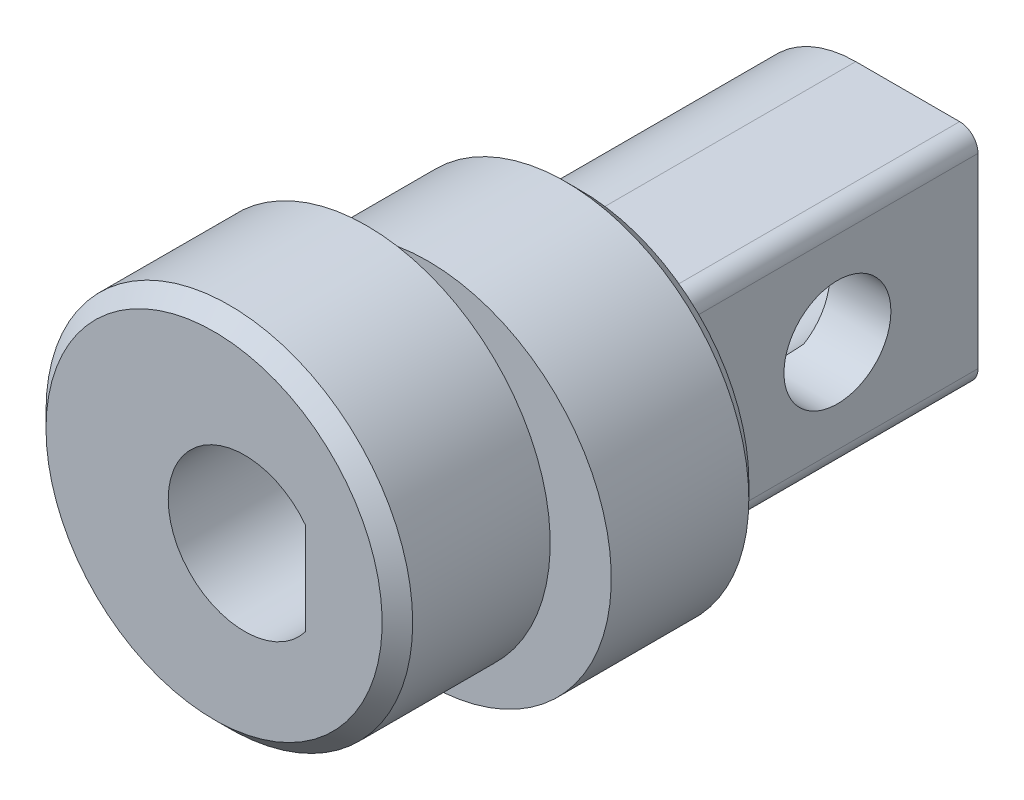
ISO-10303-21;
HEADER;
FILE_DESCRIPTION(('STEP AP214'),'2;1');
FILE_NAME('part.step','',(''),(''),'','','');
FILE_SCHEMA(('AUTOMOTIVE_DESIGN { 1 0 10303 214 1 1 1 1 }'));
ENDSEC;
DATA;
#1=APPLICATION_CONTEXT('core data for automotive mechanical design processes');
#2=APPLICATION_PROTOCOL_DEFINITION('international standard','automotive_design',2000,#1);
#3=PRODUCT_CONTEXT('',#1,'mechanical');
#4=PRODUCT('Part','Part','',(#3));
#5=PRODUCT_RELATED_PRODUCT_CATEGORY('part','',(#4));
#6=PRODUCT_DEFINITION_FORMATION('','',#4);
#7=PRODUCT_DEFINITION_CONTEXT('part definition',#1,'design');
#8=PRODUCT_DEFINITION('design','',#6,#7);
#9=PRODUCT_DEFINITION_SHAPE('','',#8);
#10=(LENGTH_UNIT() NAMED_UNIT(*) SI_UNIT(.MILLI.,.METRE.));
#11=(NAMED_UNIT(*) PLANE_ANGLE_UNIT() SI_UNIT($,.RADIAN.));
#12=(NAMED_UNIT(*) SI_UNIT($,.STERADIAN.) SOLID_ANGLE_UNIT());
#13=UNCERTAINTY_MEASURE_WITH_UNIT(LENGTH_MEASURE(1.E-05),#10,'distance_accuracy_value','');
#14=(GEOMETRIC_REPRESENTATION_CONTEXT(3) GLOBAL_UNCERTAINTY_ASSIGNED_CONTEXT((#13)) GLOBAL_UNIT_ASSIGNED_CONTEXT((#10,
#11,#12)) REPRESENTATION_CONTEXT('',''));
#15=CARTESIAN_POINT('',(0.,0.,0.));
#16=DIRECTION('',(0.,0.,1.));
#17=DIRECTION('',(1.,0.,0.));
#18=AXIS2_PLACEMENT_3D('',#15,#16,#17);
#19=CARTESIAN_POINT('',(1.,-1.5,10.4000000000133));
#20=DIRECTION('',(-1.,0.,0.));
#21=DIRECTION('',(0.,0.,1.));
#22=AXIS2_PLACEMENT_3D('',#19,#20,#21);
#23=PLANE('',#22);
#24=CARTESIAN_POINT('',(1.,0.,-5.));
#25=DIRECTION('',(-1.,0.,0.));
#26=DIRECTION('',(0.,0.,1.));
#27=AXIS2_PLACEMENT_3D('',#24,#25,#26);
#28=CIRCLE('',#27,1.74999999999999);
#29=CARTESIAN_POINT('',(1.,1.5,-5.90138781886598));
#30=VERTEX_POINT('',#29);
#31=CARTESIAN_POINT('',(1.,-1.5,-5.90138781886599));
#32=VERTEX_POINT('',#31);
#33=EDGE_CURVE('E61',#30,#32,#28,.T.);
#34=ORIENTED_EDGE('',*,*,#33,.F.);
#35=DIRECTION('',(0.,0.,-1.));
#36=VECTOR('',#35,1.);
#37=CARTESIAN_POINT('',(1.,1.5,10.4000000000133));
#38=LINE('',#37,#36);
#39=CARTESIAN_POINT('',(1.,1.5,-9.59999999998672));
#40=VERTEX_POINT('',#39);
#41=EDGE_CURVE('E68',#30,#40,#38,.T.);
#42=ORIENTED_EDGE('',*,*,#41,.T.);
#43=DIRECTION('',(0.,1.,0.));
#44=VECTOR('',#43,1.);
#45=CARTESIAN_POINT('',(1.,-1.5,-9.59999999998672));
#46=LINE('',#45,#44);
#47=CARTESIAN_POINT('',(1.,-1.5,-9.59999999998672));
#48=VERTEX_POINT('',#47);
#49=EDGE_CURVE('E250',#48,#40,#46,.T.);
#50=ORIENTED_EDGE('',*,*,#49,.F.);
#51=DIRECTION('',(0.,0.,-1.));
#52=VECTOR('',#51,1.);
#53=CARTESIAN_POINT('',(1.,-1.5,10.4000000000133));
#54=LINE('',#53,#52);
#55=EDGE_CURVE('E153',#32,#48,#54,.T.);
#56=ORIENTED_EDGE('',*,*,#55,.F.);
#57=EDGE_LOOP('',(#34,#42,#50,#56));
#58=FACE_BOUND('',#57,.T.);
#59=ADVANCED_FACE('F45',(#58),#23,.T.);
#60=CARTESIAN_POINT('',(2.4,3.05,-9.59999999998672));
#61=DIRECTION('',(0.,0.,1.));
#62=DIRECTION('',(1.,0.,0.));
#63=AXIS2_PLACEMENT_3D('',#60,#61,#62);
#64=PLANE('',#63);
#65=CARTESIAN_POINT('',(2.4,3.05,-9.59999999998672));
#66=DIRECTION('',(0.,0.,-1.));
#67=DIRECTION('',(1.,0.,0.));
#68=AXIS2_PLACEMENT_3D('',#65,#66,#67);
#69=CIRCLE('',#68,0.6);
#70=CARTESIAN_POINT('',(2.4,3.65,-9.59999999998672));
#71=VERTEX_POINT('',#70);
#72=CARTESIAN_POINT('',(3.,3.05,-9.59999999998672));
#73=VERTEX_POINT('',#72);
#74=EDGE_CURVE('E162',#71,#73,#69,.T.);
#75=ORIENTED_EDGE('',*,*,#74,.T.);
#76=DIRECTION('',(0.,-1.,0.));
#77=VECTOR('',#76,1.);
#78=CARTESIAN_POINT('',(3.,-3.05,-9.59999999998672));
#79=LINE('',#78,#77);
#80=CARTESIAN_POINT('',(3.,-3.05,-9.59999999998672));
#81=VERTEX_POINT('',#80);
#82=EDGE_CURVE('E165',#73,#81,#79,.T.);
#83=ORIENTED_EDGE('',*,*,#82,.T.);
#84=CARTESIAN_POINT('',(2.4,-3.05,-9.59999999998672));
#85=DIRECTION('',(0.,0.,-1.));
#86=DIRECTION('',(1.,0.,0.));
#87=AXIS2_PLACEMENT_3D('',#84,#85,#86);
#88=CIRCLE('',#87,0.6);
#89=CARTESIAN_POINT('',(2.4,-3.65,-9.59999999998672));
#90=VERTEX_POINT('',#89);
#91=EDGE_CURVE('E168',#81,#90,#88,.T.);
#92=ORIENTED_EDGE('',*,*,#91,.T.);
#93=DIRECTION('',(-1.,0.,0.));
#94=VECTOR('',#93,1.);
#95=CARTESIAN_POINT('',(-1.,-3.65,-9.59999999998672));
#96=LINE('',#95,#94);
#97=CARTESIAN_POINT('',(-1.,-3.65,-9.59999999998672));
#98=VERTEX_POINT('',#97);
#99=EDGE_CURVE('E170',#90,#98,#96,.T.);
#100=ORIENTED_EDGE('',*,*,#99,.T.);
#101=CARTESIAN_POINT('',(-1.,0.,-9.59999999998672));
#102=DIRECTION('',(0.,0.,-1.));
#103=DIRECTION('',(1.,0.,0.));
#104=AXIS2_PLACEMENT_3D('',#101,#102,#103);
#105=CIRCLE('',#104,3.65);
#106=CARTESIAN_POINT('',(-1.,3.65,-9.59999999998672));
#107=VERTEX_POINT('',#106);
#108=EDGE_CURVE('E172',#98,#107,#105,.T.);
#109=ORIENTED_EDGE('',*,*,#108,.T.);
#110=DIRECTION('',(1.,0.,0.));
#111=VECTOR('',#110,1.);
#112=CARTESIAN_POINT('',(2.4,3.65,-9.59999999998672));
#113=LINE('',#112,#111);
#114=EDGE_CURVE('E174',#107,#71,#113,.T.);
#115=ORIENTED_EDGE('',*,*,#114,.T.);
#116=EDGE_LOOP('',(#75,#83,#92,#100,#109,#115));
#117=FACE_BOUND('',#116,.T.);
#118=CARTESIAN_POINT('',(-1.,0.,-9.59999999998672));
#119=DIRECTION('',(0.,0.,1.));
#120=DIRECTION('',(1.,0.,0.));
#121=AXIS2_PLACEMENT_3D('',#118,#119,#120);
#122=CIRCLE('',#121,2.5);
#123=EDGE_CURVE('E245',#40,#48,#122,.T.);
#124=ORIENTED_EDGE('',*,*,#123,.T.);
#125=ORIENTED_EDGE('',*,*,#49,.T.);
#126=EDGE_LOOP('',(#124,#125));
#127=FACE_BOUND('',#126,.T.);
#128=ADVANCED_FACE('F237',(#117,#127),#64,.F.);
#129=CARTESIAN_POINT('',(-2.,0.,10.4000000000133));
#130=DIRECTION('',(0.,0.,-1.));
#131=DIRECTION('',(-1.,0.,0.));
#132=AXIS2_PLACEMENT_3D('',#129,#130,#131);
#133=PLANE('',#132);
#134=CARTESIAN_POINT('',(-2.,0.,10.4000000000133));
#135=DIRECTION('',(0.,0.,-1.));
#136=DIRECTION('',(-1.,0.,0.));
#137=AXIS2_PLACEMENT_3D('',#134,#135,#136);
#138=CIRCLE('',#137,5.5);
#139=CARTESIAN_POINT('',(-7.5,0.,10.4000000000133));
#140=VERTEX_POINT('',#139);
#141=EDGE_CURVE('E11',#140,#140,#138,.F.);
#142=ORIENTED_EDGE('',*,*,#141,.T.);
#143=EDGE_LOOP('',(#142));
#144=FACE_BOUND('',#143,.T.);
#145=CARTESIAN_POINT('',(-1.,0.,10.4000000000133));
#146=DIRECTION('',(0.,0.,1.));
#147=DIRECTION('',(1.,0.,0.));
#148=AXIS2_PLACEMENT_3D('',#145,#146,#147);
#149=CIRCLE('',#148,2.5);
#150=CARTESIAN_POINT('',(1.,1.5,10.4000000000133));
#151=VERTEX_POINT('',#150);
#152=CARTESIAN_POINT('',(1.,-1.5,10.4000000000133));
#153=VERTEX_POINT('',#152);
#154=EDGE_CURVE('E150',#151,#153,#149,.T.);
#155=ORIENTED_EDGE('',*,*,#154,.F.);
#156=DIRECTION('',(0.,1.,0.));
#157=VECTOR('',#156,1.);
#158=CARTESIAN_POINT('',(1.,-1.5,10.4000000000133));
#159=LINE('',#158,#157);
#160=EDGE_CURVE('E248',#153,#151,#159,.T.);
#161=ORIENTED_EDGE('',*,*,#160,.F.);
#162=EDGE_LOOP('',(#155,#161));
#163=FACE_BOUND('',#162,.T.);
#164=ADVANCED_FACE('F242',(#144,#163),#133,.F.);
#165=CARTESIAN_POINT('',(0.,0.,0.400000000013279));
#166=DIRECTION('',(0.,0.,1.));
#167=DIRECTION('',(1.,0.,0.));
#168=AXIS2_PLACEMENT_3D('',#165,#166,#167);
#169=PLANE('',#168);
#170=CARTESIAN_POINT('',(0.,0.,0.400000000013279));
#171=DIRECTION('',(0.,0.,1.));
#172=DIRECTION('',(1.,0.,0.));
#173=AXIS2_PLACEMENT_3D('',#170,#171,#172);
#174=CIRCLE('',#173,5.49999999999999);
#175=CARTESIAN_POINT('',(5.49999999999999,0.,0.400000000013279));
#176=VERTEX_POINT('',#175);
#177=EDGE_CURVE('E319',#176,#176,#174,.F.);
#178=ORIENTED_EDGE('',*,*,#177,.T.);
#179=EDGE_LOOP('',(#178));
#180=FACE_BOUND('',#179,.T.);
#181=CARTESIAN_POINT('',(2.4,3.05,0.400000000013279));
#182=DIRECTION('',(0.,0.,-1.));
#183=DIRECTION('',(1.,0.,0.));
#184=AXIS2_PLACEMENT_3D('',#181,#182,#183);
#185=CIRCLE('',#184,0.6);
#186=CARTESIAN_POINT('',(2.4,3.65,0.400000000013279));
#187=VERTEX_POINT('',#186);
#188=CARTESIAN_POINT('',(3.,3.05,0.400000000013279));
#189=VERTEX_POINT('',#188);
#190=EDGE_CURVE('E161',#187,#189,#185,.T.);
#191=ORIENTED_EDGE('',*,*,#190,.F.);
#192=DIRECTION('',(1.,0.,0.));
#193=VECTOR('',#192,1.);
#194=CARTESIAN_POINT('',(2.4,3.65,0.400000000013279));
#195=LINE('',#194,#193);
#196=CARTESIAN_POINT('',(-1.,3.65,0.400000000013279));
#197=VERTEX_POINT('',#196);
#198=EDGE_CURVE('E166',#197,#187,#195,.T.);
#199=ORIENTED_EDGE('',*,*,#198,.F.);
#200=CARTESIAN_POINT('',(-1.,0.,0.400000000013279));
#201=DIRECTION('',(0.,0.,-1.));
#202=DIRECTION('',(1.,0.,0.));
#203=AXIS2_PLACEMENT_3D('',#200,#201,#202);
#204=CIRCLE('',#203,3.65);
#205=CARTESIAN_POINT('',(-1.,-3.65,0.400000000013279));
#206=VERTEX_POINT('',#205);
#207=EDGE_CURVE('E188',#206,#197,#204,.T.);
#208=ORIENTED_EDGE('',*,*,#207,.F.);
#209=DIRECTION('',(-1.,0.,0.));
#210=VECTOR('',#209,1.);
#211=CARTESIAN_POINT('',(-1.,-3.65,0.400000000013279));
#212=LINE('',#211,#210);
#213=CARTESIAN_POINT('',(2.4,-3.65,0.400000000013279));
#214=VERTEX_POINT('',#213);
#215=EDGE_CURVE('E185',#214,#206,#212,.T.);
#216=ORIENTED_EDGE('',*,*,#215,.F.);
#217=CARTESIAN_POINT('',(2.4,-3.05,0.400000000013279));
#218=DIRECTION('',(0.,0.,-1.));
#219=DIRECTION('',(1.,0.,0.));
#220=AXIS2_PLACEMENT_3D('',#217,#218,#219);
#221=CIRCLE('',#220,0.6);
#222=CARTESIAN_POINT('',(3.,-3.05,0.400000000013279));
#223=VERTEX_POINT('',#222);
#224=EDGE_CURVE('E182',#223,#214,#221,.T.);
#225=ORIENTED_EDGE('',*,*,#224,.F.);
#226=DIRECTION('',(0.,-1.,0.));
#227=VECTOR('',#226,1.);
#228=CARTESIAN_POINT('',(3.,-3.05,0.400000000013279));
#229=LINE('',#228,#227);
#230=EDGE_CURVE('E179',#189,#223,#229,.T.);
#231=ORIENTED_EDGE('',*,*,#230,.F.);
#232=EDGE_LOOP('',(#191,#199,#208,#216,#225,#231));
#233=FACE_BOUND('',#232,.T.);
#234=ADVANCED_FACE('F275',(#180,#233),#169,.F.);
#235=CARTESIAN_POINT('',(0.,0.,5.40000000001328));
#236=DIRECTION('',(0.,0.,-1.));
#237=DIRECTION('',(-1.,0.,0.));
#238=AXIS2_PLACEMENT_3D('',#235,#236,#237);
#239=CYLINDRICAL_SURFACE('',#238,6.);
#240=CARTESIAN_POINT('',(0.,0.,0.900000000084335));
#241=DIRECTION('',(0.,0.,1.));
#242=DIRECTION('',(1.,0.,0.));
#243=AXIS2_PLACEMENT_3D('',#240,#241,#242);
#244=CIRCLE('',#243,6.);
#245=CARTESIAN_POINT('',(6.,0.,0.900000000084335));
#246=VERTEX_POINT('',#245);
#247=EDGE_CURVE('E322',#246,#246,#244,.T.);
#248=ORIENTED_EDGE('',*,*,#247,.T.);
#249=EDGE_LOOP('',(#248));
#250=FACE_BOUND('',#249,.T.);
#251=CARTESIAN_POINT('',(0.,0.,5.40000000001328));
#252=DIRECTION('',(0.,0.,1.));
#253=DIRECTION('',(1.,0.,0.));
#254=AXIS2_PLACEMENT_3D('',#251,#252,#253);
#255=CIRCLE('',#254,6.);
#256=CARTESIAN_POINT('',(-0.999999999999995,5.91607978309962,5.40000000001328));
#257=VERTEX_POINT('',#256);
#258=CARTESIAN_POINT('',(-0.999999999999995,-5.91607978309962,5.40000000001328));
#259=VERTEX_POINT('',#258);
#260=EDGE_CURVE('E137',#257,#259,#255,.T.);
#261=ORIENTED_EDGE('',*,*,#260,.F.);
#262=EDGE_CURVE('E210',#259,#257,#255,.T.);
#263=ORIENTED_EDGE('',*,*,#262,.F.);
#264=EDGE_LOOP('',(#261,#263));
#265=FACE_BOUND('',#264,.T.);
#266=ADVANCED_FACE('F299',(#250,#265),#239,.T.);
#267=CARTESIAN_POINT('',(0.,0.,5.40000000001328));
#268=DIRECTION('',(0.,0.,1.));
#269=DIRECTION('',(1.,0.,0.));
#270=AXIS2_PLACEMENT_3D('',#267,#268,#269);
#271=PLANE('',#270);
#272=ORIENTED_EDGE('',*,*,#262,.T.);
#273=CARTESIAN_POINT('',(-2.,0.,5.40000000001328));
#274=DIRECTION('',(0.,0.,-1.));
#275=DIRECTION('',(-1.,0.,0.));
#276=AXIS2_PLACEMENT_3D('',#273,#274,#275);
#277=CIRCLE('',#276,6.);
#278=EDGE_CURVE('E155',#257,#259,#277,.T.);
#279=ORIENTED_EDGE('',*,*,#278,.T.);
#280=EDGE_LOOP('',(#272,#279));
#281=FACE_BOUND('',#280,.T.);
#282=ADVANCED_FACE('F296',(#281),#271,.T.);
#283=CARTESIAN_POINT('',(2.4,3.05,-9.59999999998672));
#284=DIRECTION('',(0.,0.,1.));
#285=DIRECTION('',(1.,0.,0.));
#286=AXIS2_PLACEMENT_3D('',#283,#284,#285);
#287=CYLINDRICAL_SURFACE('',#286,0.6);
#288=ORIENTED_EDGE('',*,*,#190,.T.);
#289=DIRECTION('',(0.,0.,1.));
#290=VECTOR('',#289,1.);
#291=CARTESIAN_POINT('',(3.,3.05,-9.59999999998672));
#292=LINE('',#291,#290);
#293=EDGE_CURVE('E207',#73,#189,#292,.T.);
#294=ORIENTED_EDGE('',*,*,#293,.F.);
#295=ORIENTED_EDGE('',*,*,#74,.F.);
#296=DIRECTION('',(0.,0.,1.));
#297=VECTOR('',#296,1.);
#298=CARTESIAN_POINT('',(2.4,3.65,-9.59999999998672));
#299=LINE('',#298,#297);
#300=EDGE_CURVE('E176',#71,#187,#299,.T.);
#301=ORIENTED_EDGE('',*,*,#300,.T.);
#302=EDGE_LOOP('',(#288,#294,#295,#301));
#303=FACE_BOUND('',#302,.T.);
#304=ADVANCED_FACE('F261',(#303),#287,.T.);
#305=CARTESIAN_POINT('',(3.,-3.05,-9.59999999998672));
#306=DIRECTION('',(-1.,0.,0.));
#307=DIRECTION('',(0.,0.,1.));
#308=AXIS2_PLACEMENT_3D('',#305,#306,#307);
#309=PLANE('',#308);
#310=CARTESIAN_POINT('',(3.,0.,-5.));
#311=DIRECTION('',(1.,0.,0.));
#312=DIRECTION('',(0.,0.,-1.));
#313=AXIS2_PLACEMENT_3D('',#310,#311,#312);
#314=CIRCLE('',#313,1.74999999999999);
#315=CARTESIAN_POINT('',(3.,0.,-6.74999999999999));
#316=VERTEX_POINT('',#315);
#317=EDGE_CURVE('E146',#316,#316,#314,.T.);
#318=ORIENTED_EDGE('',*,*,#317,.F.);
#319=EDGE_LOOP('',(#318));
#320=FACE_BOUND('',#319,.T.);
#321=ORIENTED_EDGE('',*,*,#230,.T.);
#322=DIRECTION('',(0.,0.,1.));
#323=VECTOR('',#322,1.);
#324=CARTESIAN_POINT('',(3.,-3.05,-9.59999999998672));
#325=LINE('',#324,#323);
#326=EDGE_CURVE('E204',#81,#223,#325,.T.);
#327=ORIENTED_EDGE('',*,*,#326,.F.);
#328=ORIENTED_EDGE('',*,*,#82,.F.);
#329=ORIENTED_EDGE('',*,*,#293,.T.);
#330=EDGE_LOOP('',(#321,#327,#328,#329));
#331=FACE_BOUND('',#330,.T.);
#332=ADVANCED_FACE('F258',(#320,#331),#309,.F.);
#333=CARTESIAN_POINT('',(2.4,-3.05,-9.59999999998672));
#334=DIRECTION('',(0.,0.,1.));
#335=DIRECTION('',(1.,0.,0.));
#336=AXIS2_PLACEMENT_3D('',#333,#334,#335);
#337=CYLINDRICAL_SURFACE('',#336,0.6);
#338=ORIENTED_EDGE('',*,*,#224,.T.);
#339=DIRECTION('',(0.,0.,1.));
#340=VECTOR('',#339,1.);
#341=CARTESIAN_POINT('',(2.4,-3.65,-9.59999999998672));
#342=LINE('',#341,#340);
#343=EDGE_CURVE('E201',#90,#214,#342,.T.);
#344=ORIENTED_EDGE('',*,*,#343,.F.);
#345=ORIENTED_EDGE('',*,*,#91,.F.);
#346=ORIENTED_EDGE('',*,*,#326,.T.);
#347=EDGE_LOOP('',(#338,#344,#345,#346));
#348=FACE_BOUND('',#347,.T.);
#349=ADVANCED_FACE('F260',(#348),#337,.T.);
#350=CARTESIAN_POINT('',(-1.,-3.65,-9.59999999998672));
#351=DIRECTION('',(0.,1.,0.));
#352=DIRECTION('',(-1.,0.,0.));
#353=AXIS2_PLACEMENT_3D('',#350,#351,#352);
#354=PLANE('',#353);
#355=ORIENTED_EDGE('',*,*,#215,.T.);
#356=DIRECTION('',(0.,0.,1.));
#357=VECTOR('',#356,1.);
#358=CARTESIAN_POINT('',(-1.,-3.65,-9.59999999998672));
#359=LINE('',#358,#357);
#360=EDGE_CURVE('E198',#98,#206,#359,.T.);
#361=ORIENTED_EDGE('',*,*,#360,.F.);
#362=ORIENTED_EDGE('',*,*,#99,.F.);
#363=ORIENTED_EDGE('',*,*,#343,.T.);
#364=EDGE_LOOP('',(#355,#361,#362,#363));
#365=FACE_BOUND('',#364,.T.);
#366=ADVANCED_FACE('F283',(#365),#354,.F.);
#367=CARTESIAN_POINT('',(-1.,0.,-9.59999999998672));
#368=DIRECTION('',(0.,0.,1.));
#369=DIRECTION('',(1.,0.,0.));
#370=AXIS2_PLACEMENT_3D('',#367,#368,#369);
#371=CYLINDRICAL_SURFACE('',#370,3.65);
#372=ORIENTED_EDGE('',*,*,#207,.T.);
#373=DIRECTION('',(0.,0.,1.));
#374=VECTOR('',#373,1.);
#375=CARTESIAN_POINT('',(-1.,3.65,-9.59999999998672));
#376=LINE('',#375,#374);
#377=EDGE_CURVE('E195',#107,#197,#376,.T.);
#378=ORIENTED_EDGE('',*,*,#377,.F.);
#379=ORIENTED_EDGE('',*,*,#108,.F.);
#380=ORIENTED_EDGE('',*,*,#360,.T.);
#381=EDGE_LOOP('',(#372,#378,#379,#380));
#382=FACE_BOUND('',#381,.T.);
#383=ADVANCED_FACE('F281',(#382),#371,.T.);
#384=CARTESIAN_POINT('',(2.4,3.65,-9.59999999998672));
#385=DIRECTION('',(0.,-1.,0.));
#386=DIRECTION('',(0.,0.,-1.));
#387=AXIS2_PLACEMENT_3D('',#384,#385,#386);
#388=PLANE('',#387);
#389=ORIENTED_EDGE('',*,*,#198,.T.);
#390=ORIENTED_EDGE('',*,*,#300,.F.);
#391=ORIENTED_EDGE('',*,*,#114,.F.);
#392=ORIENTED_EDGE('',*,*,#377,.T.);
#393=EDGE_LOOP('',(#389,#390,#391,#392));
#394=FACE_BOUND('',#393,.T.);
#395=ADVANCED_FACE('F277',(#394),#388,.F.);
#396=CARTESIAN_POINT('',(-2.,0.,10.4000000000133));
#397=DIRECTION('',(0.,0.,-1.));
#398=DIRECTION('',(-1.,0.,0.));
#399=AXIS2_PLACEMENT_3D('',#396,#397,#398);
#400=CYLINDRICAL_SURFACE('',#399,6.);
#401=CARTESIAN_POINT('',(-2.,0.,9.89999999994223));
#402=DIRECTION('',(0.,0.,-1.));
#403=DIRECTION('',(-1.,0.,0.));
#404=AXIS2_PLACEMENT_3D('',#401,#402,#403);
#405=CIRCLE('',#404,6.);
#406=CARTESIAN_POINT('',(-8.,0.,9.89999999994223));
#407=VERTEX_POINT('',#406);
#408=EDGE_CURVE('E54',#407,#407,#405,.T.);
#409=ORIENTED_EDGE('',*,*,#408,.T.);
#410=EDGE_LOOP('',(#409));
#411=FACE_BOUND('',#410,.T.);
#412=ORIENTED_EDGE('',*,*,#278,.F.);
#413=EDGE_CURVE('E152',#259,#257,#277,.T.);
#414=ORIENTED_EDGE('',*,*,#413,.F.);
#415=EDGE_LOOP('',(#412,#414));
#416=FACE_BOUND('',#415,.T.);
#417=ADVANCED_FACE('F327',(#411,#416),#400,.T.);
#418=CARTESIAN_POINT('',(-2.,0.,5.40000000001328));
#419=DIRECTION('',(0.,0.,-1.));
#420=DIRECTION('',(-1.,0.,0.));
#421=AXIS2_PLACEMENT_3D('',#418,#419,#420);
#422=PLANE('',#421);
#423=ORIENTED_EDGE('',*,*,#413,.T.);
#424=ORIENTED_EDGE('',*,*,#260,.T.);
#425=EDGE_LOOP('',(#423,#424));
#426=FACE_BOUND('',#425,.T.);
#427=ADVANCED_FACE('F235',(#426),#422,.T.);
#428=CARTESIAN_POINT('',(-1.,0.,10.4000000000133));
#429=DIRECTION('',(0.,0.,-1.));
#430=DIRECTION('',(-1.,0.,0.));
#431=AXIS2_PLACEMENT_3D('',#428,#429,#430);
#432=CYLINDRICAL_SURFACE('',#431,2.5);
#433=CARTESIAN_POINT('',(0.999999999999999,1.5,-4.09861218113402));
#434=CARTESIAN_POINT('',(0.969196936761246,1.54111506463078,-4.16704609545675));
#435=CARTESIAN_POINT('',(0.939551625431204,1.5779439990415,-4.23894035325243));
#436=CARTESIAN_POINT('',(0.885442784406417,1.6422139841659,-4.38971580683063));
#437=CARTESIAN_POINT('',(0.861045604016702,1.66953725295177,-4.46867040289528));
#438=CARTESIAN_POINT('',(0.821027031406401,1.71311578005956,-4.63263139476398));
#439=CARTESIAN_POINT('',(0.805480204594599,1.72927723431148,-4.71768260489365));
#440=CARTESIAN_POINT('',(0.786712965405767,1.74867444545503,-4.89007658765763));
#441=CARTESIAN_POINT('',(0.783406213472691,1.75200074659436,-4.97739891664062));
#442=CARTESIAN_POINT('',(0.789150045867142,1.74612012012797,-5.13797902342276));
#443=CARTESIAN_POINT('',(0.796421022082723,1.73871875077734,-5.2113812941522));
#444=CARTESIAN_POINT('',(0.819060202597797,1.71501770059205,-5.35580888232999));
#445=CARTESIAN_POINT('',(0.834472159342985,1.69866992138504,-5.42681912910629));
#446=CARTESIAN_POINT('',(0.872407133468149,1.6567804074307,-5.56865644187989));
#447=CARTESIAN_POINT('',(0.895283978823761,1.63076968730701,-5.63924455706428));
#448=CARTESIAN_POINT('',(0.945146852278374,1.57096277825587,-5.77458360518461));
#449=CARTESIAN_POINT('',(0.972088936639223,1.53724807103234,-5.83938639648568));
#450=CARTESIAN_POINT('',(0.999999999999999,1.5,-5.90138781886598));
#451=B_SPLINE_CURVE_WITH_KNOTS('',3,(#433,#434,#435,#436,#437,#438,#439,#440,#441,#442,#443,
#444,#445,#446,#447,#448,#449,#450),.UNSPECIFIED.,.F.,.F.,(4,2,2,2,2,2,2,2,4),(0.,
0.256989676870287,0.517058825168968,0.779287840399346,1.03966356984459,1.26097355616433,
1.48348522483027,1.71862071478859,1.95137581640571),.UNSPECIFIED.);
#452=CARTESIAN_POINT('',(1.,1.5,-4.09861218113402));
#453=VERTEX_POINT('',#452);
#454=EDGE_CURVE('E136',#453,#30,#451,.T.);
#455=ORIENTED_EDGE('',*,*,#454,.F.);
#456=EDGE_CURVE('E145',#151,#453,#38,.T.);
#457=ORIENTED_EDGE('',*,*,#456,.F.);
#458=ORIENTED_EDGE('',*,*,#154,.T.);
#459=CARTESIAN_POINT('',(1.,-1.5,-4.09861218113401));
#460=VERTEX_POINT('',#459);
#461=EDGE_CURVE('E142',#153,#460,#54,.T.);
#462=ORIENTED_EDGE('',*,*,#461,.T.);
#463=CARTESIAN_POINT('',(1.,-1.5,-5.90138781886599));
#464=CARTESIAN_POINT('',(0.969196936761246,-1.54111506463077,-5.83295390454325));
#465=CARTESIAN_POINT('',(0.939551625431204,-1.57794399904149,-5.76105964674757));
#466=CARTESIAN_POINT('',(0.885442784406416,-1.6422139841659,-5.61028419316937));
#467=CARTESIAN_POINT('',(0.861045604016701,-1.66953725295177,-5.53132959710472));
#468=CARTESIAN_POINT('',(0.8210270314064,-1.71311578005956,-5.36736860523602));
#469=CARTESIAN_POINT('',(0.805480204594598,-1.72927723431148,-5.28231739510635));
#470=CARTESIAN_POINT('',(0.786712965405765,-1.74867444545503,-5.10992341234237));
#471=CARTESIAN_POINT('',(0.783406213472688,-1.75200074659436,-5.02260108335938));
#472=CARTESIAN_POINT('',(0.789150045867139,-1.74612012012797,-4.86202097657724));
#473=CARTESIAN_POINT('',(0.796421022082719,-1.73871875077734,-4.78861870584781));
#474=CARTESIAN_POINT('',(0.819060202597793,-1.71501770059205,-4.64419111767002));
#475=CARTESIAN_POINT('',(0.834472159342982,-1.69866992138504,-4.57318087089371));
#476=CARTESIAN_POINT('',(0.872407133468146,-1.6567804074307,-4.43134355812011));
#477=CARTESIAN_POINT('',(0.895283978823759,-1.63076968730701,-4.36075544293571));
#478=CARTESIAN_POINT('',(0.945146852278374,-1.57096277825587,-4.22541639481538));
#479=CARTESIAN_POINT('',(0.972088936639224,-1.53724807103234,-4.16061360351431));
#480=CARTESIAN_POINT('',(1.,-1.5,-4.09861218113401));
#481=B_SPLINE_CURVE_WITH_KNOTS('',3,(#463,#464,#465,#466,#467,#468,#469,#470,#471,#472,#473,
#474,#475,#476,#477,#478,#479,#480),.UNSPECIFIED.,.F.,.F.,(4,2,2,2,2,2,2,2,4),(0.,
0.256989676870288,0.517058825168971,0.77928784039935,1.03966356984459,1.26097355616434,
1.48348522483028,1.7186207147886,1.95137581640573),.UNSPECIFIED.);
#482=EDGE_CURVE('E127',#32,#460,#481,.T.);
#483=ORIENTED_EDGE('',*,*,#482,.F.);
#484=ORIENTED_EDGE('',*,*,#55,.T.);
#485=ORIENTED_EDGE('',*,*,#123,.F.);
#486=ORIENTED_EDGE('',*,*,#41,.F.);
#487=EDGE_LOOP('',(#455,#457,#458,#462,#483,#484,#485,#486));
#488=FACE_BOUND('',#487,.T.);
#489=ADVANCED_FACE('F148',(#488),#432,.F.);
#490=EDGE_CURVE('E131',#460,#453,#28,.T.);
#491=ORIENTED_EDGE('',*,*,#490,.F.);
#492=ORIENTED_EDGE('',*,*,#461,.F.);
#493=ORIENTED_EDGE('',*,*,#160,.T.);
#494=ORIENTED_EDGE('',*,*,#456,.T.);
#495=EDGE_LOOP('',(#491,#492,#493,#494));
#496=FACE_BOUND('',#495,.T.);
#497=ADVANCED_FACE('F141',(#496),#23,.T.);
#498=CARTESIAN_POINT('',(3.,0.,-5.));
#499=DIRECTION('',(1.,0.,0.));
#500=DIRECTION('',(0.,0.,-1.));
#501=AXIS2_PLACEMENT_3D('',#498,#499,#500);
#502=CYLINDRICAL_SURFACE('',#501,1.74999999999999);
#503=ORIENTED_EDGE('',*,*,#454,.T.);
#504=ORIENTED_EDGE('',*,*,#33,.T.);
#505=ORIENTED_EDGE('',*,*,#482,.T.);
#506=ORIENTED_EDGE('',*,*,#490,.T.);
#507=EDGE_LOOP('',(#503,#504,#505,#506));
#508=FACE_BOUND('',#507,.T.);
#509=ORIENTED_EDGE('',*,*,#317,.T.);
#510=EDGE_LOOP('',(#509));
#511=FACE_BOUND('',#510,.T.);
#512=ADVANCED_FACE('F129',(#508,#511),#502,.F.);
#513=CARTESIAN_POINT('',(0.,0.,0.900000000084335));
#514=DIRECTION('',(0.,0.,1.));
#515=DIRECTION('',(1.,0.,0.));
#516=AXIS2_PLACEMENT_3D('',#513,#514,#515);
#517=CONICAL_SURFACE('',#516,6.,0.785398163326398);
#518=ORIENTED_EDGE('',*,*,#177,.F.);
#519=EDGE_LOOP('',(#518));
#520=FACE_BOUND('',#519,.T.);
#521=ORIENTED_EDGE('',*,*,#247,.F.);
#522=EDGE_LOOP('',(#521));
#523=FACE_BOUND('',#522,.T.);
#524=ADVANCED_FACE('F229',(#520,#523),#517,.T.);
#525=CARTESIAN_POINT('',(-2.,0.,9.89999999994223));
#526=DIRECTION('',(0.,0.,-1.));
#527=DIRECTION('',(-1.,0.,0.));
#528=AXIS2_PLACEMENT_3D('',#525,#526,#527);
#529=CONICAL_SURFACE('',#528,6.,0.785398163326398);
#530=ORIENTED_EDGE('',*,*,#141,.F.);
#531=EDGE_LOOP('',(#530));
#532=FACE_BOUND('',#531,.T.);
#533=ORIENTED_EDGE('',*,*,#408,.F.);
#534=EDGE_LOOP('',(#533));
#535=FACE_BOUND('',#534,.T.);
#536=ADVANCED_FACE('F48',(#532,#535),#529,.T.);
#537=CLOSED_SHELL('',(#59,#128,#164,#234,#266,#282,#304,#332,#349,#366,#383,#395,#417,#427,#489,
#497,#512,#524,#536));
#538=MANIFOLD_SOLID_BREP('B2',#537);
#539=ADVANCED_BREP_SHAPE_REPRESENTATION('',(#18,#538),#14);
#540=SHAPE_DEFINITION_REPRESENTATION(#9,#539);
ENDSEC;
END-ISO-10303-21;
